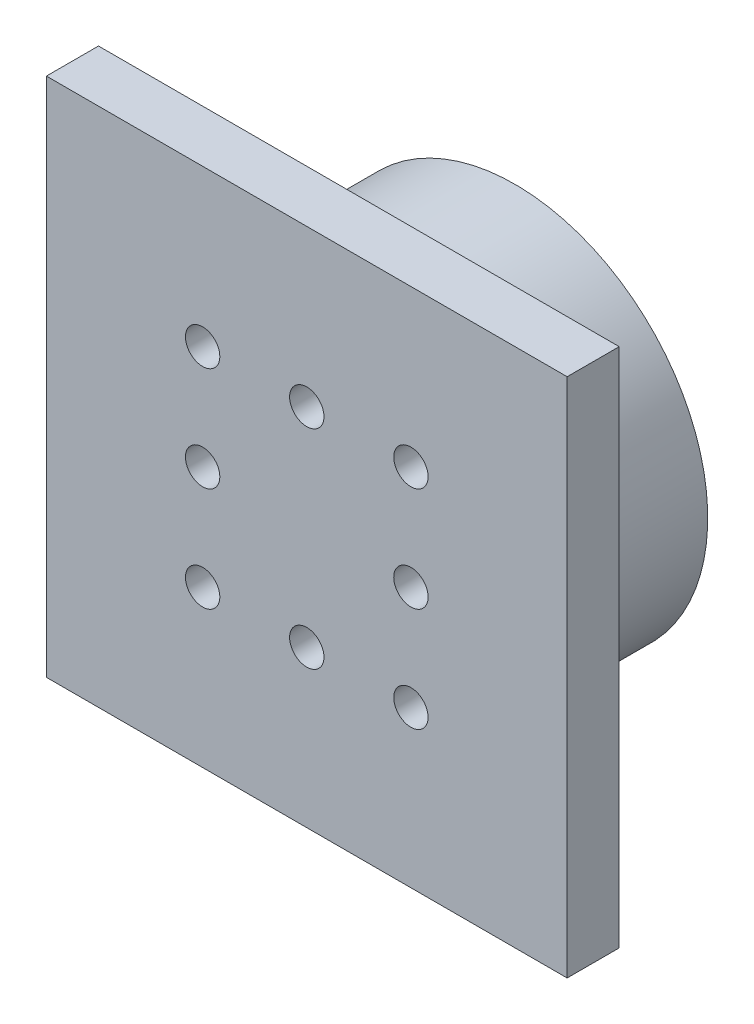
ISO-10303-21;
HEADER;
FILE_DESCRIPTION(('STEP AP214'),'2;1');
FILE_NAME('part.step','',(''),(''),'','','');
FILE_SCHEMA(('AUTOMOTIVE_DESIGN { 1 0 10303 214 1 1 1 1 }'));
ENDSEC;
DATA;
#1=APPLICATION_CONTEXT('core data for automotive mechanical design processes');
#2=APPLICATION_PROTOCOL_DEFINITION('international standard','automotive_design',2000,#1);
#3=PRODUCT_CONTEXT('',#1,'mechanical');
#4=PRODUCT('Part','Part','',(#3));
#5=PRODUCT_RELATED_PRODUCT_CATEGORY('part','',(#4));
#6=PRODUCT_DEFINITION_FORMATION('','',#4);
#7=PRODUCT_DEFINITION_CONTEXT('part definition',#1,'design');
#8=PRODUCT_DEFINITION('design','',#6,#7);
#9=PRODUCT_DEFINITION_SHAPE('','',#8);
#10=(LENGTH_UNIT() NAMED_UNIT(*) SI_UNIT(.MILLI.,.METRE.));
#11=(NAMED_UNIT(*) PLANE_ANGLE_UNIT() SI_UNIT($,.RADIAN.));
#12=(NAMED_UNIT(*) SI_UNIT($,.STERADIAN.) SOLID_ANGLE_UNIT());
#13=UNCERTAINTY_MEASURE_WITH_UNIT(LENGTH_MEASURE(1.E-05),#10,'distance_accuracy_value','');
#14=(GEOMETRIC_REPRESENTATION_CONTEXT(3) GLOBAL_UNCERTAINTY_ASSIGNED_CONTEXT((#13)) GLOBAL_UNIT_ASSIGNED_CONTEXT((#10,
#11,#12)) REPRESENTATION_CONTEXT('',''));
#15=CARTESIAN_POINT('',(0.,0.,0.));
#16=DIRECTION('',(0.,0.,1.));
#17=DIRECTION('',(1.,0.,0.));
#18=AXIS2_PLACEMENT_3D('',#15,#16,#17);
#19=CARTESIAN_POINT('',(0.,0.,5.));
#20=DIRECTION('',(0.,0.,1.));
#21=DIRECTION('',(1.,0.,0.));
#22=AXIS2_PLACEMENT_3D('',#19,#20,#21);
#23=PLANE('',#22);
#24=CARTESIAN_POINT('',(10.,0.,5.));
#25=DIRECTION('',(0.,0.,1.));
#26=DIRECTION('',(-1.,0.,0.));
#27=AXIS2_PLACEMENT_3D('',#24,#25,#26);
#28=CIRCLE('',#27,1.65);
#29=CARTESIAN_POINT('',(8.35,0.,5.));
#30=VERTEX_POINT('',#29);
#31=EDGE_CURVE('E131',#30,#30,#28,.T.);
#32=ORIENTED_EDGE('',*,*,#31,.F.);
#33=EDGE_LOOP('',(#32));
#34=FACE_BOUND('',#33,.T.);
#35=CARTESIAN_POINT('',(0.,-9.99999999999998,5.));
#36=DIRECTION('',(0.,0.,1.));
#37=DIRECTION('',(-1.,0.,0.));
#38=AXIS2_PLACEMENT_3D('',#35,#36,#37);
#39=CIRCLE('',#38,1.65);
#40=CARTESIAN_POINT('',(-1.65,-9.99999999999998,5.));
#41=VERTEX_POINT('',#40);
#42=EDGE_CURVE('E125',#41,#41,#39,.T.);
#43=ORIENTED_EDGE('',*,*,#42,.F.);
#44=EDGE_LOOP('',(#43));
#45=FACE_BOUND('',#44,.T.);
#46=CARTESIAN_POINT('',(-10.,0.,5.));
#47=DIRECTION('',(0.,0.,1.));
#48=DIRECTION('',(1.,0.,0.));
#49=AXIS2_PLACEMENT_3D('',#46,#47,#48);
#50=CIRCLE('',#49,1.65);
#51=CARTESIAN_POINT('',(-8.35,0.,5.));
#52=VERTEX_POINT('',#51);
#53=EDGE_CURVE('E119',#52,#52,#50,.T.);
#54=ORIENTED_EDGE('',*,*,#53,.F.);
#55=EDGE_LOOP('',(#54));
#56=FACE_BOUND('',#55,.T.);
#57=CARTESIAN_POINT('',(-10.,10.,5.));
#58=DIRECTION('',(0.,0.,1.));
#59=DIRECTION('',(1.,0.,0.));
#60=AXIS2_PLACEMENT_3D('',#57,#58,#59);
#61=CIRCLE('',#60,1.65);
#62=CARTESIAN_POINT('',(-8.35,10.,5.));
#63=VERTEX_POINT('',#62);
#64=EDGE_CURVE('E103',#63,#63,#61,.T.);
#65=ORIENTED_EDGE('',*,*,#64,.F.);
#66=EDGE_LOOP('',(#65));
#67=FACE_BOUND('',#66,.T.);
#68=DIRECTION('',(0.,1.,0.));
#69=VECTOR('',#68,1.);
#70=CARTESIAN_POINT('',(25.,25.,5.));
#71=LINE('',#70,#69);
#72=CARTESIAN_POINT('',(25.,-25.,5.));
#73=VERTEX_POINT('',#72);
#74=CARTESIAN_POINT('',(25.,25.,5.));
#75=VERTEX_POINT('',#74);
#76=EDGE_CURVE('E87',#73,#75,#71,.T.);
#77=ORIENTED_EDGE('',*,*,#76,.T.);
#78=DIRECTION('',(-1.,0.,0.));
#79=VECTOR('',#78,1.);
#80=CARTESIAN_POINT('',(-25.,25.,5.));
#81=LINE('',#80,#79);
#82=CARTESIAN_POINT('',(-25.,25.,5.));
#83=VERTEX_POINT('',#82);
#84=EDGE_CURVE('E82',#75,#83,#81,.T.);
#85=ORIENTED_EDGE('',*,*,#84,.T.);
#86=DIRECTION('',(0.,-1.,0.));
#87=VECTOR('',#86,1.);
#88=CARTESIAN_POINT('',(-25.,25.,5.));
#89=LINE('',#88,#87);
#90=CARTESIAN_POINT('',(-25.,-25.,5.));
#91=VERTEX_POINT('',#90);
#92=EDGE_CURVE('E85',#83,#91,#89,.T.);
#93=ORIENTED_EDGE('',*,*,#92,.T.);
#94=DIRECTION('',(1.,0.,0.));
#95=VECTOR('',#94,1.);
#96=CARTESIAN_POINT('',(-25.,-25.,5.));
#97=LINE('',#96,#95);
#98=EDGE_CURVE('E51',#91,#73,#97,.T.);
#99=ORIENTED_EDGE('',*,*,#98,.T.);
#100=EDGE_LOOP('',(#77,#85,#93,#99));
#101=FACE_BOUND('',#100,.T.);
#102=CARTESIAN_POINT('',(0.,10.,5.));
#103=DIRECTION('',(0.,0.,1.));
#104=DIRECTION('',(1.,0.,0.));
#105=AXIS2_PLACEMENT_3D('',#102,#103,#104);
#106=CIRCLE('',#105,1.65);
#107=CARTESIAN_POINT('',(1.65,10.,5.));
#108=VERTEX_POINT('',#107);
#109=EDGE_CURVE('E116',#108,#108,#106,.T.);
#110=ORIENTED_EDGE('',*,*,#109,.F.);
#111=EDGE_LOOP('',(#110));
#112=FACE_BOUND('',#111,.T.);
#113=CARTESIAN_POINT('',(-10.,-9.99999999999999,5.));
#114=DIRECTION('',(0.,0.,1.));
#115=DIRECTION('',(-1.,0.,0.));
#116=AXIS2_PLACEMENT_3D('',#113,#114,#115);
#117=CIRCLE('',#116,1.65);
#118=CARTESIAN_POINT('',(-11.65,-9.99999999999999,5.));
#119=VERTEX_POINT('',#118);
#120=EDGE_CURVE('E122',#119,#119,#117,.T.);
#121=ORIENTED_EDGE('',*,*,#120,.F.);
#122=EDGE_LOOP('',(#121));
#123=FACE_BOUND('',#122,.T.);
#124=CARTESIAN_POINT('',(10.,-9.99999999999999,5.));
#125=DIRECTION('',(0.,0.,1.));
#126=DIRECTION('',(1.,0.,0.));
#127=AXIS2_PLACEMENT_3D('',#124,#125,#126);
#128=CIRCLE('',#127,1.65);
#129=CARTESIAN_POINT('',(11.65,-9.99999999999999,5.));
#130=VERTEX_POINT('',#129);
#131=EDGE_CURVE('E128',#130,#130,#128,.T.);
#132=ORIENTED_EDGE('',*,*,#131,.F.);
#133=EDGE_LOOP('',(#132));
#134=FACE_BOUND('',#133,.T.);
#135=CARTESIAN_POINT('',(9.99999999999999,10.,5.));
#136=DIRECTION('',(0.,0.,1.));
#137=DIRECTION('',(-1.,0.,0.));
#138=AXIS2_PLACEMENT_3D('',#135,#136,#137);
#139=CIRCLE('',#138,1.65);
#140=CARTESIAN_POINT('',(8.34999999999999,10.,5.));
#141=VERTEX_POINT('',#140);
#142=EDGE_CURVE('E134',#141,#141,#139,.T.);
#143=ORIENTED_EDGE('',*,*,#142,.F.);
#144=EDGE_LOOP('',(#143));
#145=FACE_BOUND('',#144,.T.);
#146=ADVANCED_FACE('F33',(#34,#45,#56,#67,#101,#112,#123,#134,#145),#23,.T.);
#147=CARTESIAN_POINT('',(0.,0.,0.));
#148=DIRECTION('',(0.,0.,1.));
#149=DIRECTION('',(1.,0.,0.));
#150=AXIS2_PLACEMENT_3D('',#147,#148,#149);
#151=PLANE('',#150);
#152=CARTESIAN_POINT('',(0.,0.,0.));
#153=DIRECTION('',(0.,0.,-1.));
#154=DIRECTION('',(-1.,0.,0.));
#155=AXIS2_PLACEMENT_3D('',#152,#153,#154);
#156=CIRCLE('',#155,18.5);
#157=CARTESIAN_POINT('',(-18.5,0.,0.));
#158=VERTEX_POINT('',#157);
#159=EDGE_CURVE('E11',#158,#158,#156,.T.);
#160=ORIENTED_EDGE('',*,*,#159,.F.);
#161=EDGE_LOOP('',(#160));
#162=FACE_BOUND('',#161,.T.);
#163=DIRECTION('',(0.,1.,0.));
#164=VECTOR('',#163,1.);
#165=CARTESIAN_POINT('',(25.,25.,0.));
#166=LINE('',#165,#164);
#167=CARTESIAN_POINT('',(25.,-25.,0.));
#168=VERTEX_POINT('',#167);
#169=CARTESIAN_POINT('',(25.,25.,0.));
#170=VERTEX_POINT('',#169);
#171=EDGE_CURVE('E100',#168,#170,#166,.T.);
#172=ORIENTED_EDGE('',*,*,#171,.F.);
#173=DIRECTION('',(1.,0.,0.));
#174=VECTOR('',#173,1.);
#175=CARTESIAN_POINT('',(-25.,-25.,0.));
#176=LINE('',#175,#174);
#177=CARTESIAN_POINT('',(-25.,-25.,0.));
#178=VERTEX_POINT('',#177);
#179=EDGE_CURVE('E74',#178,#168,#176,.T.);
#180=ORIENTED_EDGE('',*,*,#179,.F.);
#181=DIRECTION('',(0.,-1.,0.));
#182=VECTOR('',#181,1.);
#183=CARTESIAN_POINT('',(-25.,25.,0.));
#184=LINE('',#183,#182);
#185=CARTESIAN_POINT('',(-25.,25.,0.));
#186=VERTEX_POINT('',#185);
#187=EDGE_CURVE('E68',#186,#178,#184,.T.);
#188=ORIENTED_EDGE('',*,*,#187,.F.);
#189=DIRECTION('',(-1.,0.,0.));
#190=VECTOR('',#189,1.);
#191=CARTESIAN_POINT('',(-25.,25.,0.));
#192=LINE('',#191,#190);
#193=EDGE_CURVE('E92',#170,#186,#192,.T.);
#194=ORIENTED_EDGE('',*,*,#193,.F.);
#195=EDGE_LOOP('',(#172,#180,#188,#194));
#196=FACE_BOUND('',#195,.T.);
#197=ADVANCED_FACE('F111',(#162,#196),#151,.F.);
#198=CARTESIAN_POINT('',(25.,25.,5.));
#199=DIRECTION('',(-1.,0.,0.));
#200=DIRECTION('',(0.,-1.,0.));
#201=AXIS2_PLACEMENT_3D('',#198,#199,#200);
#202=PLANE('',#201);
#203=ORIENTED_EDGE('',*,*,#171,.T.);
#204=DIRECTION('',(0.,0.,-1.));
#205=VECTOR('',#204,1.);
#206=CARTESIAN_POINT('',(25.,25.,5.));
#207=LINE('',#206,#205);
#208=EDGE_CURVE('E37',#75,#170,#207,.T.);
#209=ORIENTED_EDGE('',*,*,#208,.F.);
#210=ORIENTED_EDGE('',*,*,#76,.F.);
#211=DIRECTION('',(0.,0.,-1.));
#212=VECTOR('',#211,1.);
#213=CARTESIAN_POINT('',(25.,-25.,5.));
#214=LINE('',#213,#212);
#215=EDGE_CURVE('E96',#73,#168,#214,.T.);
#216=ORIENTED_EDGE('',*,*,#215,.T.);
#217=EDGE_LOOP('',(#203,#209,#210,#216));
#218=FACE_BOUND('',#217,.T.);
#219=ADVANCED_FACE('F35',(#218),#202,.F.);
#220=CARTESIAN_POINT('',(-25.,25.,5.));
#221=DIRECTION('',(0.,-1.,0.));
#222=DIRECTION('',(1.,0.,0.));
#223=AXIS2_PLACEMENT_3D('',#220,#221,#222);
#224=PLANE('',#223);
#225=ORIENTED_EDGE('',*,*,#193,.T.);
#226=DIRECTION('',(0.,0.,-1.));
#227=VECTOR('',#226,1.);
#228=CARTESIAN_POINT('',(-25.,25.,5.));
#229=LINE('',#228,#227);
#230=EDGE_CURVE('E90',#83,#186,#229,.T.);
#231=ORIENTED_EDGE('',*,*,#230,.F.);
#232=ORIENTED_EDGE('',*,*,#84,.F.);
#233=ORIENTED_EDGE('',*,*,#208,.T.);
#234=EDGE_LOOP('',(#225,#231,#232,#233));
#235=FACE_BOUND('',#234,.T.);
#236=ADVANCED_FACE('F91',(#235),#224,.F.);
#237=CARTESIAN_POINT('',(-25.,25.,5.));
#238=DIRECTION('',(1.,0.,0.));
#239=DIRECTION('',(0.,1.,0.));
#240=AXIS2_PLACEMENT_3D('',#237,#238,#239);
#241=PLANE('',#240);
#242=ORIENTED_EDGE('',*,*,#187,.T.);
#243=DIRECTION('',(0.,0.,-1.));
#244=VECTOR('',#243,1.);
#245=CARTESIAN_POINT('',(-25.,-25.,5.));
#246=LINE('',#245,#244);
#247=EDGE_CURVE('E93',#91,#178,#246,.T.);
#248=ORIENTED_EDGE('',*,*,#247,.F.);
#249=ORIENTED_EDGE('',*,*,#92,.F.);
#250=ORIENTED_EDGE('',*,*,#230,.T.);
#251=EDGE_LOOP('',(#242,#248,#249,#250));
#252=FACE_BOUND('',#251,.T.);
#253=ADVANCED_FACE('F94',(#252),#241,.F.);
#254=CARTESIAN_POINT('',(-25.,-25.,5.));
#255=DIRECTION('',(0.,1.,0.));
#256=DIRECTION('',(0.,0.,1.));
#257=AXIS2_PLACEMENT_3D('',#254,#255,#256);
#258=PLANE('',#257);
#259=ORIENTED_EDGE('',*,*,#179,.T.);
#260=ORIENTED_EDGE('',*,*,#215,.F.);
#261=ORIENTED_EDGE('',*,*,#98,.F.);
#262=ORIENTED_EDGE('',*,*,#247,.T.);
#263=EDGE_LOOP('',(#259,#260,#261,#262));
#264=FACE_BOUND('',#263,.T.);
#265=ADVANCED_FACE('F108',(#264),#258,.F.);
#266=CARTESIAN_POINT('',(-10.,10.,5.));
#267=DIRECTION('',(0.,0.,-1.));
#268=DIRECTION('',(-1.,0.,0.));
#269=AXIS2_PLACEMENT_3D('',#266,#267,#268);
#270=CYLINDRICAL_SURFACE('',#269,1.65);
#271=ORIENTED_EDGE('',*,*,#64,.T.);
#272=EDGE_LOOP('',(#271));
#273=FACE_BOUND('',#272,.T.);
#274=CARTESIAN_POINT('',(-10.,10.,-15.));
#275=DIRECTION('',(0.,0.,-1.));
#276=DIRECTION('',(-1.,0.,0.));
#277=AXIS2_PLACEMENT_3D('',#274,#275,#276);
#278=CIRCLE('',#277,1.65);
#279=CARTESIAN_POINT('',(-11.65,10.,-15.));
#280=VERTEX_POINT('',#279);
#281=EDGE_CURVE('E161',#280,#280,#278,.T.);
#282=ORIENTED_EDGE('',*,*,#281,.T.);
#283=EDGE_LOOP('',(#282));
#284=FACE_BOUND('',#283,.T.);
#285=ADVANCED_FACE('F203',(#273,#284),#270,.F.);
#286=CARTESIAN_POINT('',(0.,10.,5.));
#287=DIRECTION('',(0.,0.,-1.));
#288=DIRECTION('',(-1.,0.,0.));
#289=AXIS2_PLACEMENT_3D('',#286,#287,#288);
#290=CYLINDRICAL_SURFACE('',#289,1.65);
#291=ORIENTED_EDGE('',*,*,#109,.T.);
#292=EDGE_LOOP('',(#291));
#293=FACE_BOUND('',#292,.T.);
#294=CARTESIAN_POINT('',(0.,10.,-15.));
#295=DIRECTION('',(0.,0.,-1.));
#296=DIRECTION('',(-1.,0.,0.));
#297=AXIS2_PLACEMENT_3D('',#294,#295,#296);
#298=CIRCLE('',#297,1.65);
#299=CARTESIAN_POINT('',(-1.65,10.,-15.));
#300=VERTEX_POINT('',#299);
#301=EDGE_CURVE('E164',#300,#300,#298,.T.);
#302=ORIENTED_EDGE('',*,*,#301,.T.);
#303=EDGE_LOOP('',(#302));
#304=FACE_BOUND('',#303,.T.);
#305=ADVANCED_FACE('F233',(#293,#304),#290,.F.);
#306=CARTESIAN_POINT('',(-10.,0.,5.));
#307=DIRECTION('',(0.,0.,-1.));
#308=DIRECTION('',(-1.,0.,0.));
#309=AXIS2_PLACEMENT_3D('',#306,#307,#308);
#310=CYLINDRICAL_SURFACE('',#309,1.65);
#311=ORIENTED_EDGE('',*,*,#53,.T.);
#312=EDGE_LOOP('',(#311));
#313=FACE_BOUND('',#312,.T.);
#314=CARTESIAN_POINT('',(-10.,0.,-15.));
#315=DIRECTION('',(0.,0.,-1.));
#316=DIRECTION('',(-1.,0.,0.));
#317=AXIS2_PLACEMENT_3D('',#314,#315,#316);
#318=CIRCLE('',#317,1.65);
#319=CARTESIAN_POINT('',(-11.65,0.,-15.));
#320=VERTEX_POINT('',#319);
#321=EDGE_CURVE('E155',#320,#320,#318,.T.);
#322=ORIENTED_EDGE('',*,*,#321,.T.);
#323=EDGE_LOOP('',(#322));
#324=FACE_BOUND('',#323,.T.);
#325=ADVANCED_FACE('F244',(#313,#324),#310,.F.);
#326=CARTESIAN_POINT('',(-10.,-9.99999999999999,5.));
#327=DIRECTION('',(0.,0.,-1.));
#328=DIRECTION('',(-1.,0.,0.));
#329=AXIS2_PLACEMENT_3D('',#326,#327,#328);
#330=CYLINDRICAL_SURFACE('',#329,1.65);
#331=ORIENTED_EDGE('',*,*,#120,.T.);
#332=EDGE_LOOP('',(#331));
#333=FACE_BOUND('',#332,.T.);
#334=CARTESIAN_POINT('',(-10.,-9.99999999999999,-15.));
#335=DIRECTION('',(0.,0.,-1.));
#336=DIRECTION('',(-1.,0.,0.));
#337=AXIS2_PLACEMENT_3D('',#334,#335,#336);
#338=CIRCLE('',#337,1.65);
#339=CARTESIAN_POINT('',(-11.65,-9.99999999999999,-15.));
#340=VERTEX_POINT('',#339);
#341=EDGE_CURVE('E144',#340,#340,#338,.T.);
#342=ORIENTED_EDGE('',*,*,#341,.T.);
#343=EDGE_LOOP('',(#342));
#344=FACE_BOUND('',#343,.T.);
#345=ADVANCED_FACE('F254',(#333,#344),#330,.F.);
#346=CARTESIAN_POINT('',(0.,-9.99999999999998,5.));
#347=DIRECTION('',(0.,0.,-1.));
#348=DIRECTION('',(-1.,0.,0.));
#349=AXIS2_PLACEMENT_3D('',#346,#347,#348);
#350=CYLINDRICAL_SURFACE('',#349,1.65);
#351=ORIENTED_EDGE('',*,*,#42,.T.);
#352=EDGE_LOOP('',(#351));
#353=FACE_BOUND('',#352,.T.);
#354=CARTESIAN_POINT('',(0.,-9.99999999999998,-15.));
#355=DIRECTION('',(0.,0.,-1.));
#356=DIRECTION('',(-1.,0.,0.));
#357=AXIS2_PLACEMENT_3D('',#354,#355,#356);
#358=CIRCLE('',#357,1.65);
#359=CARTESIAN_POINT('',(-1.65,-9.99999999999998,-15.));
#360=VERTEX_POINT('',#359);
#361=EDGE_CURVE('E149',#360,#360,#358,.T.);
#362=ORIENTED_EDGE('',*,*,#361,.T.);
#363=EDGE_LOOP('',(#362));
#364=FACE_BOUND('',#363,.T.);
#365=ADVANCED_FACE('F265',(#353,#364),#350,.F.);
#366=CARTESIAN_POINT('',(10.,-9.99999999999999,5.));
#367=DIRECTION('',(0.,0.,-1.));
#368=DIRECTION('',(-1.,0.,0.));
#369=AXIS2_PLACEMENT_3D('',#366,#367,#368);
#370=CYLINDRICAL_SURFACE('',#369,1.65);
#371=ORIENTED_EDGE('',*,*,#131,.T.);
#372=EDGE_LOOP('',(#371));
#373=FACE_BOUND('',#372,.T.);
#374=CARTESIAN_POINT('',(10.,-9.99999999999999,-15.));
#375=DIRECTION('',(0.,0.,-1.));
#376=DIRECTION('',(-1.,0.,0.));
#377=AXIS2_PLACEMENT_3D('',#374,#375,#376);
#378=CIRCLE('',#377,1.64999999999999);
#379=CARTESIAN_POINT('',(8.35,-9.99999999999999,-15.));
#380=VERTEX_POINT('',#379);
#381=EDGE_CURVE('E152',#380,#380,#378,.T.);
#382=ORIENTED_EDGE('',*,*,#381,.T.);
#383=EDGE_LOOP('',(#382));
#384=FACE_BOUND('',#383,.T.);
#385=ADVANCED_FACE('F276',(#373,#384),#370,.F.);
#386=CARTESIAN_POINT('',(10.,0.,5.));
#387=DIRECTION('',(0.,0.,-1.));
#388=DIRECTION('',(-1.,0.,0.));
#389=AXIS2_PLACEMENT_3D('',#386,#387,#388);
#390=CYLINDRICAL_SURFACE('',#389,1.65);
#391=ORIENTED_EDGE('',*,*,#31,.T.);
#392=EDGE_LOOP('',(#391));
#393=FACE_BOUND('',#392,.T.);
#394=CARTESIAN_POINT('',(10.,0.,-15.));
#395=DIRECTION('',(0.,0.,-1.));
#396=DIRECTION('',(-1.,0.,0.));
#397=AXIS2_PLACEMENT_3D('',#394,#395,#396);
#398=CIRCLE('',#397,1.65);
#399=CARTESIAN_POINT('',(8.35,0.,-15.));
#400=VERTEX_POINT('',#399);
#401=EDGE_CURVE('E158',#400,#400,#398,.T.);
#402=ORIENTED_EDGE('',*,*,#401,.T.);
#403=EDGE_LOOP('',(#402));
#404=FACE_BOUND('',#403,.T.);
#405=ADVANCED_FACE('F185',(#393,#404),#390,.F.);
#406=CARTESIAN_POINT('',(9.99999999999999,10.,5.));
#407=DIRECTION('',(0.,0.,-1.));
#408=DIRECTION('',(-1.,0.,0.));
#409=AXIS2_PLACEMENT_3D('',#406,#407,#408);
#410=CYLINDRICAL_SURFACE('',#409,1.65);
#411=ORIENTED_EDGE('',*,*,#142,.T.);
#412=EDGE_LOOP('',(#411));
#413=FACE_BOUND('',#412,.T.);
#414=CARTESIAN_POINT('',(9.99999999999999,10.,-15.));
#415=DIRECTION('',(0.,0.,-1.));
#416=DIRECTION('',(-1.,0.,0.));
#417=AXIS2_PLACEMENT_3D('',#414,#415,#416);
#418=CIRCLE('',#417,1.65);
#419=CARTESIAN_POINT('',(8.35,10.,-15.));
#420=VERTEX_POINT('',#419);
#421=EDGE_CURVE('E167',#420,#420,#418,.T.);
#422=ORIENTED_EDGE('',*,*,#421,.T.);
#423=EDGE_LOOP('',(#422));
#424=FACE_BOUND('',#423,.T.);
#425=ADVANCED_FACE('F171',(#413,#424),#410,.F.);
#426=CARTESIAN_POINT('',(0.,0.,-15.));
#427=DIRECTION('',(0.,0.,-1.));
#428=DIRECTION('',(-1.,0.,0.));
#429=AXIS2_PLACEMENT_3D('',#426,#427,#428);
#430=PLANE('',#429);
#431=ORIENTED_EDGE('',*,*,#301,.F.);
#432=EDGE_LOOP('',(#431));
#433=FACE_BOUND('',#432,.T.);
#434=ORIENTED_EDGE('',*,*,#401,.F.);
#435=EDGE_LOOP('',(#434));
#436=FACE_BOUND('',#435,.T.);
#437=ORIENTED_EDGE('',*,*,#381,.F.);
#438=EDGE_LOOP('',(#437));
#439=FACE_BOUND('',#438,.T.);
#440=ORIENTED_EDGE('',*,*,#341,.F.);
#441=EDGE_LOOP('',(#440));
#442=FACE_BOUND('',#441,.T.);
#443=CARTESIAN_POINT('',(0.,0.,-15.));
#444=DIRECTION('',(0.,0.,-1.));
#445=DIRECTION('',(-1.,0.,0.));
#446=AXIS2_PLACEMENT_3D('',#443,#444,#445);
#447=CIRCLE('',#446,18.5);
#448=CARTESIAN_POINT('',(-18.5,0.,-15.));
#449=VERTEX_POINT('',#448);
#450=EDGE_CURVE('E136',#449,#449,#447,.T.);
#451=ORIENTED_EDGE('',*,*,#450,.T.);
#452=EDGE_LOOP('',(#451));
#453=FACE_BOUND('',#452,.T.);
#454=CARTESIAN_POINT('',(0.,0.,-15.));
#455=DIRECTION('',(0.,0.,-1.));
#456=DIRECTION('',(-1.,0.,0.));
#457=AXIS2_PLACEMENT_3D('',#454,#455,#456);
#458=CIRCLE('',#457,5.);
#459=CARTESIAN_POINT('',(-5.,0.,-15.));
#460=VERTEX_POINT('',#459);
#461=EDGE_CURVE('E140',#460,#460,#458,.T.);
#462=ORIENTED_EDGE('',*,*,#461,.F.);
#463=EDGE_LOOP('',(#462));
#464=FACE_BOUND('',#463,.T.);
#465=ORIENTED_EDGE('',*,*,#361,.F.);
#466=EDGE_LOOP('',(#465));
#467=FACE_BOUND('',#466,.T.);
#468=ORIENTED_EDGE('',*,*,#321,.F.);
#469=EDGE_LOOP('',(#468));
#470=FACE_BOUND('',#469,.T.);
#471=ORIENTED_EDGE('',*,*,#281,.F.);
#472=EDGE_LOOP('',(#471));
#473=FACE_BOUND('',#472,.T.);
#474=ORIENTED_EDGE('',*,*,#421,.F.);
#475=EDGE_LOOP('',(#474));
#476=FACE_BOUND('',#475,.T.);
#477=ADVANCED_FACE('F173',(#433,#436,#439,#442,#453,#464,#467,#470,#473,#476),#430,.T.);
#478=CARTESIAN_POINT('',(0.,0.,-15.));
#479=DIRECTION('',(0.,0.,1.));
#480=DIRECTION('',(1.,0.,0.));
#481=AXIS2_PLACEMENT_3D('',#478,#479,#480);
#482=CYLINDRICAL_SURFACE('',#481,18.5);
#483=ORIENTED_EDGE('',*,*,#450,.F.);
#484=EDGE_LOOP('',(#483));
#485=FACE_BOUND('',#484,.T.);
#486=ORIENTED_EDGE('',*,*,#159,.T.);
#487=EDGE_LOOP('',(#486));
#488=FACE_BOUND('',#487,.T.);
#489=ADVANCED_FACE('F175',(#485,#488),#482,.T.);
#490=CARTESIAN_POINT('',(0.,0.,-15.));
#491=DIRECTION('',(0.,0.,1.));
#492=DIRECTION('',(1.,0.,0.));
#493=AXIS2_PLACEMENT_3D('',#490,#491,#492);
#494=CYLINDRICAL_SURFACE('',#493,5.);
#495=ORIENTED_EDGE('',*,*,#461,.T.);
#496=EDGE_LOOP('',(#495));
#497=FACE_BOUND('',#496,.T.);
#498=CARTESIAN_POINT('',(0.,0.,0.));
#499=DIRECTION('',(0.,0.,-1.));
#500=DIRECTION('',(-1.,0.,0.));
#501=AXIS2_PLACEMENT_3D('',#498,#499,#500);
#502=CIRCLE('',#501,5.);
#503=CARTESIAN_POINT('',(-5.,0.,0.));
#504=VERTEX_POINT('',#503);
#505=EDGE_CURVE('E141',#504,#504,#502,.T.);
#506=ORIENTED_EDGE('',*,*,#505,.F.);
#507=EDGE_LOOP('',(#506));
#508=FACE_BOUND('',#507,.T.);
#509=ADVANCED_FACE('F182',(#497,#508),#494,.F.);
#510=ORIENTED_EDGE('',*,*,#505,.T.);
#511=EDGE_LOOP('',(#510));
#512=FACE_BOUND('',#511,.T.);
#513=ADVANCED_FACE('F199',(#512),#151,.F.);
#514=CLOSED_SHELL('',(#146,#197,#219,#236,#253,#265,#285,#305,#325,#345,#365,#385,#405,#425,
#477,#489,#509,#513));
#515=MANIFOLD_SOLID_BREP('B2',#514);
#516=ADVANCED_BREP_SHAPE_REPRESENTATION('',(#18,#515),#14);
#517=SHAPE_DEFINITION_REPRESENTATION(#9,#516);
ENDSEC;
END-ISO-10303-21;
